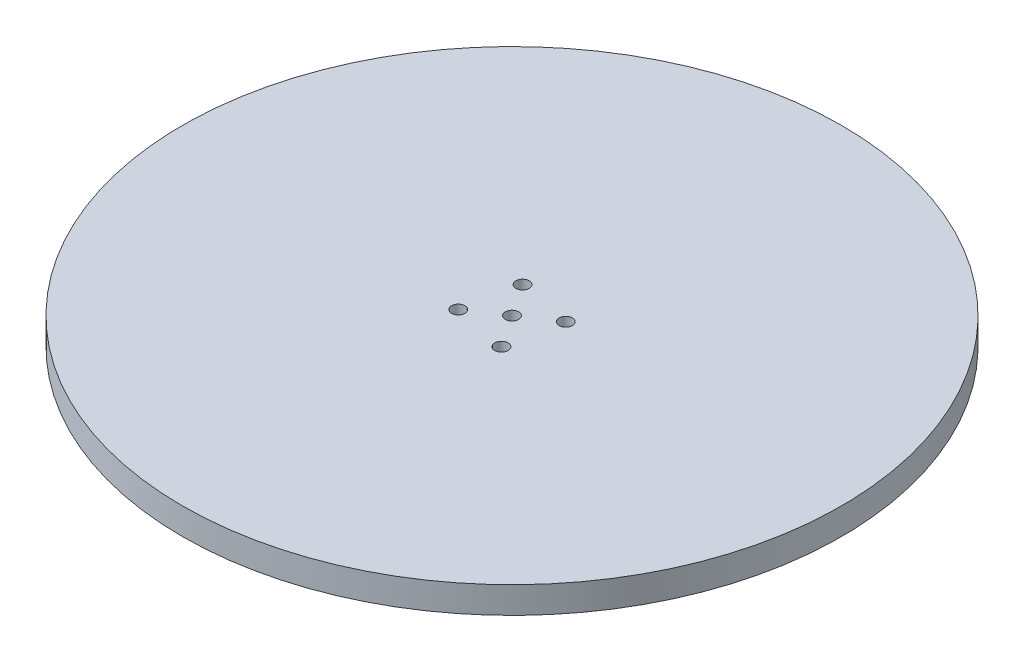
ISO-10303-21;
HEADER;
FILE_DESCRIPTION(('STEP AP214'),'2;1');
FILE_NAME('part.step','',(''),(''),'','','');
FILE_SCHEMA(('AUTOMOTIVE_DESIGN { 1 0 10303 214 1 1 1 1 }'));
ENDSEC;
DATA;
#1=APPLICATION_CONTEXT('core data for automotive mechanical design processes');
#2=APPLICATION_PROTOCOL_DEFINITION('international standard','automotive_design',2000,#1);
#3=PRODUCT_CONTEXT('',#1,'mechanical');
#4=PRODUCT('Part','Part','',(#3));
#5=PRODUCT_RELATED_PRODUCT_CATEGORY('part','',(#4));
#6=PRODUCT_DEFINITION_FORMATION('','',#4);
#7=PRODUCT_DEFINITION_CONTEXT('part definition',#1,'design');
#8=PRODUCT_DEFINITION('design','',#6,#7);
#9=PRODUCT_DEFINITION_SHAPE('','',#8);
#10=(LENGTH_UNIT() NAMED_UNIT(*) SI_UNIT(.MILLI.,.METRE.));
#11=(NAMED_UNIT(*) PLANE_ANGLE_UNIT() SI_UNIT($,.RADIAN.));
#12=(NAMED_UNIT(*) SI_UNIT($,.STERADIAN.) SOLID_ANGLE_UNIT());
#13=UNCERTAINTY_MEASURE_WITH_UNIT(LENGTH_MEASURE(1.E-05),#10,'distance_accuracy_value','');
#14=(GEOMETRIC_REPRESENTATION_CONTEXT(3) GLOBAL_UNCERTAINTY_ASSIGNED_CONTEXT((#13)) GLOBAL_UNIT_ASSIGNED_CONTEXT((#10,
#11,#12)) REPRESENTATION_CONTEXT('',''));
#15=CARTESIAN_POINT('',(0.,0.,0.));
#16=DIRECTION('',(0.,0.,1.));
#17=DIRECTION('',(1.,0.,0.));
#18=AXIS2_PLACEMENT_3D('',#15,#16,#17);
#19=CARTESIAN_POINT('',(0.,5.,0.));
#20=DIRECTION('',(0.,-1.,0.));
#21=DIRECTION('',(0.,0.,-1.));
#22=AXIS2_PLACEMENT_3D('',#19,#20,#21);
#23=CYLINDRICAL_SURFACE('',#22,61.9125);
#24=CARTESIAN_POINT('',(0.,5.,0.));
#25=DIRECTION('',(0.,1.,0.));
#26=DIRECTION('',(0.,0.,1.));
#27=AXIS2_PLACEMENT_3D('',#24,#25,#26);
#28=CIRCLE('',#27,61.9125);
#29=CARTESIAN_POINT('',(0.,5.,61.9125));
#30=VERTEX_POINT('',#29);
#31=EDGE_CURVE('E38',#30,#30,#28,.T.);
#32=ORIENTED_EDGE('',*,*,#31,.F.);
#33=EDGE_LOOP('',(#32));
#34=FACE_BOUND('',#33,.T.);
#35=CARTESIAN_POINT('',(0.,0.,0.));
#36=DIRECTION('',(0.,1.,0.));
#37=DIRECTION('',(0.,0.,1.));
#38=AXIS2_PLACEMENT_3D('',#35,#36,#37);
#39=CIRCLE('',#38,61.9125);
#40=CARTESIAN_POINT('',(0.,0.,61.9125));
#41=VERTEX_POINT('',#40);
#42=EDGE_CURVE('E42',#41,#41,#39,.T.);
#43=ORIENTED_EDGE('',*,*,#42,.T.);
#44=EDGE_LOOP('',(#43));
#45=FACE_BOUND('',#44,.T.);
#46=ADVANCED_FACE('F32',(#34,#45),#23,.T.);
#47=CARTESIAN_POINT('',(0.,5.,0.));
#48=DIRECTION('',(0.,1.,0.));
#49=DIRECTION('',(0.,0.,1.));
#50=AXIS2_PLACEMENT_3D('',#47,#48,#49);
#51=PLANE('',#50);
#52=CARTESIAN_POINT('',(0.,5.,0.));
#53=DIRECTION('',(0.,-1.,0.));
#54=DIRECTION('',(0.,0.,-1.));
#55=AXIS2_PLACEMENT_3D('',#52,#53,#54);
#56=CIRCLE('',#55,1.25);
#57=CARTESIAN_POINT('',(0.,5.,-1.25));
#58=VERTEX_POINT('',#57);
#59=EDGE_CURVE('E70',#58,#58,#56,.T.);
#60=ORIENTED_EDGE('',*,*,#59,.T.);
#61=EDGE_LOOP('',(#60));
#62=FACE_BOUND('',#61,.T.);
#63=CARTESIAN_POINT('',(-4.05849304840324,5.,-6.04375993699804));
#64=DIRECTION('',(0.,-1.,0.));
#65=DIRECTION('',(0.,0.,-1.));
#66=AXIS2_PLACEMENT_3D('',#63,#64,#65);
#67=CIRCLE('',#66,1.25);
#68=CARTESIAN_POINT('',(-4.05849304840324,5.,-7.29375993699804));
#69=VERTEX_POINT('',#68);
#70=EDGE_CURVE('E77',#69,#69,#67,.T.);
#71=ORIENTED_EDGE('',*,*,#70,.T.);
#72=EDGE_LOOP('',(#71));
#73=FACE_BOUND('',#72,.T.);
#74=CARTESIAN_POINT('',(-6.04375993699803,5.,4.05849304840326));
#75=DIRECTION('',(0.,-1.,0.));
#76=DIRECTION('',(0.,0.,-1.));
#77=AXIS2_PLACEMENT_3D('',#74,#75,#76);
#78=CIRCLE('',#77,1.25);
#79=CARTESIAN_POINT('',(-6.04375993699803,5.,2.80849304840326));
#80=VERTEX_POINT('',#79);
#81=EDGE_CURVE('E83',#80,#80,#78,.T.);
#82=ORIENTED_EDGE('',*,*,#81,.T.);
#83=EDGE_LOOP('',(#82));
#84=FACE_BOUND('',#83,.T.);
#85=CARTESIAN_POINT('',(4.0584930484032,5.,6.04375993699807));
#86=DIRECTION('',(0.,-1.,0.));
#87=DIRECTION('',(0.,0.,-1.));
#88=AXIS2_PLACEMENT_3D('',#85,#86,#87);
#89=CIRCLE('',#88,1.25);
#90=CARTESIAN_POINT('',(4.0584930484032,5.,4.79375993699807));
#91=VERTEX_POINT('',#90);
#92=EDGE_CURVE('E69',#91,#91,#89,.T.);
#93=ORIENTED_EDGE('',*,*,#92,.T.);
#94=EDGE_LOOP('',(#93));
#95=FACE_BOUND('',#94,.T.);
#96=CARTESIAN_POINT('',(6.04375993699805,5.,-4.05849304840322));
#97=DIRECTION('',(0.,-1.,0.));
#98=DIRECTION('',(0.,0.,-1.));
#99=AXIS2_PLACEMENT_3D('',#96,#97,#98);
#100=CIRCLE('',#99,1.25);
#101=CARTESIAN_POINT('',(6.04375993699805,5.,-5.30849304840322));
#102=VERTEX_POINT('',#101);
#103=EDGE_CURVE('E66',#102,#102,#100,.T.);
#104=ORIENTED_EDGE('',*,*,#103,.T.);
#105=EDGE_LOOP('',(#104));
#106=FACE_BOUND('',#105,.T.);
#107=ORIENTED_EDGE('',*,*,#31,.T.);
#108=EDGE_LOOP('',(#107));
#109=FACE_BOUND('',#108,.T.);
#110=ADVANCED_FACE('F127',(#62,#73,#84,#95,#106,#109),#51,.T.);
#111=CARTESIAN_POINT('',(0.,0.,0.));
#112=DIRECTION('',(0.,1.,0.));
#113=DIRECTION('',(0.,0.,1.));
#114=AXIS2_PLACEMENT_3D('',#111,#112,#113);
#115=PLANE('',#114);
#116=CARTESIAN_POINT('',(0.,0.,0.));
#117=DIRECTION('',(0.,1.,0.));
#118=DIRECTION('',(0.,0.,1.));
#119=AXIS2_PLACEMENT_3D('',#116,#117,#118);
#120=CIRCLE('',#119,32.5);
#121=CARTESIAN_POINT('',(0.,0.,32.5));
#122=VERTEX_POINT('',#121);
#123=EDGE_CURVE('E49',#122,#122,#120,.T.);
#124=ORIENTED_EDGE('',*,*,#123,.T.);
#125=EDGE_LOOP('',(#124));
#126=FACE_BOUND('',#125,.T.);
#127=ORIENTED_EDGE('',*,*,#42,.F.);
#128=EDGE_LOOP('',(#127));
#129=FACE_BOUND('',#128,.T.);
#130=ADVANCED_FACE('F117',(#126,#129),#115,.F.);
#131=CARTESIAN_POINT('',(0.,-7.,0.));
#132=DIRECTION('',(0.,1.,0.));
#133=DIRECTION('',(0.,0.,1.));
#134=AXIS2_PLACEMENT_3D('',#131,#132,#133);
#135=CYLINDRICAL_SURFACE('',#134,32.5);
#136=CARTESIAN_POINT('',(0.,-7.,0.));
#137=DIRECTION('',(0.,1.,0.));
#138=DIRECTION('',(0.,0.,1.));
#139=AXIS2_PLACEMENT_3D('',#136,#137,#138);
#140=CIRCLE('',#139,32.5);
#141=CARTESIAN_POINT('',(0.,-7.,32.5));
#142=VERTEX_POINT('',#141);
#143=EDGE_CURVE('E47',#142,#142,#140,.T.);
#144=ORIENTED_EDGE('',*,*,#143,.T.);
#145=EDGE_LOOP('',(#144));
#146=FACE_BOUND('',#145,.T.);
#147=ORIENTED_EDGE('',*,*,#123,.F.);
#148=EDGE_LOOP('',(#147));
#149=FACE_BOUND('',#148,.T.);
#150=ADVANCED_FACE('F126',(#146,#149),#135,.T.);
#151=CARTESIAN_POINT('',(0.,-7.,0.));
#152=DIRECTION('',(0.,1.,0.));
#153=DIRECTION('',(0.,0.,1.));
#154=AXIS2_PLACEMENT_3D('',#151,#152,#153);
#155=PLANE('',#154);
#156=CARTESIAN_POINT('',(0.,-7.,0.));
#157=DIRECTION('',(0.,1.,0.));
#158=DIRECTION('',(0.,0.,1.));
#159=AXIS2_PLACEMENT_3D('',#156,#157,#158);
#160=CIRCLE('',#159,23.5);
#161=CARTESIAN_POINT('',(0.,-7.,23.5));
#162=VERTEX_POINT('',#161);
#163=EDGE_CURVE('E52',#162,#162,#160,.T.);
#164=ORIENTED_EDGE('',*,*,#163,.T.);
#165=EDGE_LOOP('',(#164));
#166=FACE_BOUND('',#165,.T.);
#167=ORIENTED_EDGE('',*,*,#143,.F.);
#168=EDGE_LOOP('',(#167));
#169=FACE_BOUND('',#168,.T.);
#170=ADVANCED_FACE('F121',(#166,#169),#155,.F.);
#171=CARTESIAN_POINT('',(0.,-7.,0.));
#172=DIRECTION('',(0.,1.,0.));
#173=DIRECTION('',(0.,0.,1.));
#174=AXIS2_PLACEMENT_3D('',#171,#172,#173);
#175=CYLINDRICAL_SURFACE('',#174,23.5);
#176=ORIENTED_EDGE('',*,*,#163,.F.);
#177=EDGE_LOOP('',(#176));
#178=FACE_BOUND('',#177,.T.);
#179=CARTESIAN_POINT('',(0.,0.,0.));
#180=DIRECTION('',(0.,1.,0.));
#181=DIRECTION('',(0.,0.,1.));
#182=AXIS2_PLACEMENT_3D('',#179,#180,#181);
#183=CIRCLE('',#182,23.5);
#184=CARTESIAN_POINT('',(0.,0.,23.5));
#185=VERTEX_POINT('',#184);
#186=EDGE_CURVE('E10',#185,#185,#183,.T.);
#187=ORIENTED_EDGE('',*,*,#186,.T.);
#188=EDGE_LOOP('',(#187));
#189=FACE_BOUND('',#188,.T.);
#190=ADVANCED_FACE('F116',(#178,#189),#175,.F.);
#191=CARTESIAN_POINT('',(0.,0.,0.));
#192=DIRECTION('',(0.,1.,0.));
#193=DIRECTION('',(0.,0.,1.));
#194=AXIS2_PLACEMENT_3D('',#191,#192,#193);
#195=CIRCLE('',#194,14.85);
#196=CARTESIAN_POINT('',(0.,0.,14.85));
#197=VERTEX_POINT('',#196);
#198=EDGE_CURVE('E58',#197,#197,#195,.T.);
#199=ORIENTED_EDGE('',*,*,#198,.T.);
#200=EDGE_LOOP('',(#199));
#201=FACE_BOUND('',#200,.T.);
#202=ORIENTED_EDGE('',*,*,#186,.F.);
#203=EDGE_LOOP('',(#202));
#204=FACE_BOUND('',#203,.T.);
#205=ADVANCED_FACE('F110',(#201,#204),#115,.F.);
#206=CARTESIAN_POINT('',(0.,-2.,0.));
#207=DIRECTION('',(0.,1.,0.));
#208=DIRECTION('',(0.,0.,1.));
#209=AXIS2_PLACEMENT_3D('',#206,#207,#208);
#210=CYLINDRICAL_SURFACE('',#209,14.85);
#211=CARTESIAN_POINT('',(0.,-2.,0.));
#212=DIRECTION('',(0.,1.,0.));
#213=DIRECTION('',(0.,0.,1.));
#214=AXIS2_PLACEMENT_3D('',#211,#212,#213);
#215=CIRCLE('',#214,14.85);
#216=CARTESIAN_POINT('',(0.,-2.,14.85));
#217=VERTEX_POINT('',#216);
#218=EDGE_CURVE('E57',#217,#217,#215,.T.);
#219=ORIENTED_EDGE('',*,*,#218,.T.);
#220=EDGE_LOOP('',(#219));
#221=FACE_BOUND('',#220,.T.);
#222=ORIENTED_EDGE('',*,*,#198,.F.);
#223=EDGE_LOOP('',(#222));
#224=FACE_BOUND('',#223,.T.);
#225=ADVANCED_FACE('F101',(#221,#224),#210,.T.);
#226=CARTESIAN_POINT('',(0.,-2.,0.));
#227=DIRECTION('',(0.,1.,0.));
#228=DIRECTION('',(0.,0.,1.));
#229=AXIS2_PLACEMENT_3D('',#226,#227,#228);
#230=PLANE('',#229);
#231=CARTESIAN_POINT('',(0.,-2.,0.));
#232=DIRECTION('',(0.,-1.,0.));
#233=DIRECTION('',(0.,0.,-1.));
#234=AXIS2_PLACEMENT_3D('',#231,#232,#233);
#235=CIRCLE('',#234,1.25);
#236=CARTESIAN_POINT('',(0.,-2.,-1.25));
#237=VERTEX_POINT('',#236);
#238=EDGE_CURVE('E74',#237,#237,#235,.T.);
#239=ORIENTED_EDGE('',*,*,#238,.F.);
#240=EDGE_LOOP('',(#239));
#241=FACE_BOUND('',#240,.T.);
#242=CARTESIAN_POINT('',(-4.05849304840324,-2.,-6.04375993699804));
#243=DIRECTION('',(0.,-1.,0.));
#244=DIRECTION('',(0.,0.,-1.));
#245=AXIS2_PLACEMENT_3D('',#242,#243,#244);
#246=CIRCLE('',#245,1.25);
#247=CARTESIAN_POINT('',(-4.05849304840324,-2.,-7.29375993699804));
#248=VERTEX_POINT('',#247);
#249=EDGE_CURVE('E73',#248,#248,#246,.T.);
#250=ORIENTED_EDGE('',*,*,#249,.F.);
#251=EDGE_LOOP('',(#250));
#252=FACE_BOUND('',#251,.T.);
#253=CARTESIAN_POINT('',(-6.04375993699803,-2.,4.05849304840326));
#254=DIRECTION('',(0.,-1.,0.));
#255=DIRECTION('',(0.,0.,-1.));
#256=AXIS2_PLACEMENT_3D('',#253,#254,#255);
#257=CIRCLE('',#256,1.25);
#258=CARTESIAN_POINT('',(-6.04375993699803,-2.,2.80849304840326));
#259=VERTEX_POINT('',#258);
#260=EDGE_CURVE('E80',#259,#259,#257,.T.);
#261=ORIENTED_EDGE('',*,*,#260,.F.);
#262=EDGE_LOOP('',(#261));
#263=FACE_BOUND('',#262,.T.);
#264=CARTESIAN_POINT('',(4.0584930484032,-2.,6.04375993699807));
#265=DIRECTION('',(0.,-1.,0.));
#266=DIRECTION('',(0.,0.,-1.));
#267=AXIS2_PLACEMENT_3D('',#264,#265,#266);
#268=CIRCLE('',#267,1.25);
#269=CARTESIAN_POINT('',(4.0584930484032,-2.,4.79375993699807));
#270=VERTEX_POINT('',#269);
#271=EDGE_CURVE('E86',#270,#270,#268,.T.);
#272=ORIENTED_EDGE('',*,*,#271,.F.);
#273=EDGE_LOOP('',(#272));
#274=FACE_BOUND('',#273,.T.);
#275=CARTESIAN_POINT('',(6.04375993699805,-2.,-4.05849304840322));
#276=DIRECTION('',(0.,-1.,0.));
#277=DIRECTION('',(0.,0.,-1.));
#278=AXIS2_PLACEMENT_3D('',#275,#276,#277);
#279=CIRCLE('',#278,1.25);
#280=CARTESIAN_POINT('',(6.04375993699805,-2.,-5.30849304840322));
#281=VERTEX_POINT('',#280);
#282=EDGE_CURVE('E61',#281,#281,#279,.T.);
#283=ORIENTED_EDGE('',*,*,#282,.F.);
#284=EDGE_LOOP('',(#283));
#285=FACE_BOUND('',#284,.T.);
#286=ORIENTED_EDGE('',*,*,#218,.F.);
#287=EDGE_LOOP('',(#286));
#288=FACE_BOUND('',#287,.T.);
#289=ADVANCED_FACE('F97',(#241,#252,#263,#274,#285,#288),#230,.F.);
#290=CARTESIAN_POINT('',(6.04375993699805,-2.,-4.05849304840322));
#291=DIRECTION('',(0.,1.,0.));
#292=DIRECTION('',(0.,0.,1.));
#293=AXIS2_PLACEMENT_3D('',#290,#291,#292);
#294=CYLINDRICAL_SURFACE('',#293,1.25);
#295=ORIENTED_EDGE('',*,*,#282,.T.);
#296=EDGE_LOOP('',(#295));
#297=FACE_BOUND('',#296,.T.);
#298=ORIENTED_EDGE('',*,*,#103,.F.);
#299=EDGE_LOOP('',(#298));
#300=FACE_BOUND('',#299,.T.);
#301=ADVANCED_FACE('F100',(#297,#300),#294,.F.);
#302=CARTESIAN_POINT('',(4.0584930484032,-2.,6.04375993699807));
#303=DIRECTION('',(0.,1.,0.));
#304=DIRECTION('',(0.,0.,1.));
#305=AXIS2_PLACEMENT_3D('',#302,#303,#304);
#306=CYLINDRICAL_SURFACE('',#305,1.25);
#307=ORIENTED_EDGE('',*,*,#271,.T.);
#308=EDGE_LOOP('',(#307));
#309=FACE_BOUND('',#308,.T.);
#310=ORIENTED_EDGE('',*,*,#92,.F.);
#311=EDGE_LOOP('',(#310));
#312=FACE_BOUND('',#311,.T.);
#313=ADVANCED_FACE('F94',(#309,#312),#306,.F.);
#314=CARTESIAN_POINT('',(-6.04375993699803,-2.,4.05849304840326));
#315=DIRECTION('',(0.,1.,0.));
#316=DIRECTION('',(0.,0.,1.));
#317=AXIS2_PLACEMENT_3D('',#314,#315,#316);
#318=CYLINDRICAL_SURFACE('',#317,1.25);
#319=ORIENTED_EDGE('',*,*,#260,.T.);
#320=EDGE_LOOP('',(#319));
#321=FACE_BOUND('',#320,.T.);
#322=ORIENTED_EDGE('',*,*,#81,.F.);
#323=EDGE_LOOP('',(#322));
#324=FACE_BOUND('',#323,.T.);
#325=ADVANCED_FACE('F158',(#321,#324),#318,.F.);
#326=CARTESIAN_POINT('',(-4.05849304840324,-2.,-6.04375993699804));
#327=DIRECTION('',(0.,1.,0.));
#328=DIRECTION('',(0.,0.,1.));
#329=AXIS2_PLACEMENT_3D('',#326,#327,#328);
#330=CYLINDRICAL_SURFACE('',#329,1.25);
#331=ORIENTED_EDGE('',*,*,#249,.T.);
#332=EDGE_LOOP('',(#331));
#333=FACE_BOUND('',#332,.T.);
#334=ORIENTED_EDGE('',*,*,#70,.F.);
#335=EDGE_LOOP('',(#334));
#336=FACE_BOUND('',#335,.T.);
#337=ADVANCED_FACE('F154',(#333,#336),#330,.F.);
#338=CARTESIAN_POINT('',(0.,-2.,0.));
#339=DIRECTION('',(0.,1.,0.));
#340=DIRECTION('',(0.,0.,1.));
#341=AXIS2_PLACEMENT_3D('',#338,#339,#340);
#342=CYLINDRICAL_SURFACE('',#341,1.25);
#343=ORIENTED_EDGE('',*,*,#238,.T.);
#344=EDGE_LOOP('',(#343));
#345=FACE_BOUND('',#344,.T.);
#346=ORIENTED_EDGE('',*,*,#59,.F.);
#347=EDGE_LOOP('',(#346));
#348=FACE_BOUND('',#347,.T.);
#349=ADVANCED_FACE('F151',(#345,#348),#342,.F.);
#350=CLOSED_SHELL('',(#46,#110,#130,#150,#170,#190,#205,#225,#289,#301,#313,#325,#337,#349));
#351=MANIFOLD_SOLID_BREP('B2',#350);
#352=ADVANCED_BREP_SHAPE_REPRESENTATION('',(#18,#351),#14);
#353=SHAPE_DEFINITION_REPRESENTATION(#9,#352);
ENDSEC;
END-ISO-10303-21;
